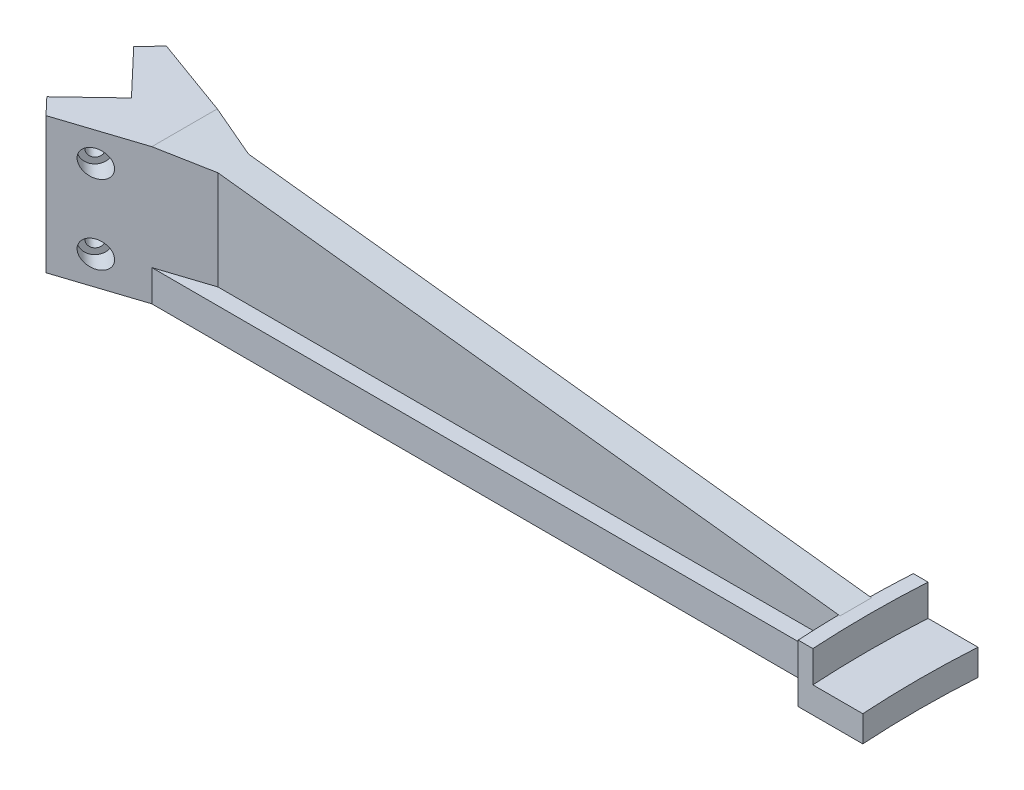
ISO-10303-21;
HEADER;
FILE_DESCRIPTION(('STEP AP214'),'2;1');
FILE_NAME('part.step','',(''),(''),'','','');
FILE_SCHEMA(('AUTOMOTIVE_DESIGN { 1 0 10303 214 1 1 1 1 }'));
ENDSEC;
DATA;
#1=APPLICATION_CONTEXT('core data for automotive mechanical design processes');
#2=APPLICATION_PROTOCOL_DEFINITION('international standard','automotive_design',2000,#1);
#3=PRODUCT_CONTEXT('',#1,'mechanical');
#4=PRODUCT('Part','Part','',(#3));
#5=PRODUCT_RELATED_PRODUCT_CATEGORY('part','',(#4));
#6=PRODUCT_DEFINITION_FORMATION('','',#4);
#7=PRODUCT_DEFINITION_CONTEXT('part definition',#1,'design');
#8=PRODUCT_DEFINITION('design','',#6,#7);
#9=PRODUCT_DEFINITION_SHAPE('','',#8);
#10=(LENGTH_UNIT() NAMED_UNIT(*) SI_UNIT(.MILLI.,.METRE.));
#11=(NAMED_UNIT(*) PLANE_ANGLE_UNIT() SI_UNIT($,.RADIAN.));
#12=(NAMED_UNIT(*) SI_UNIT($,.STERADIAN.) SOLID_ANGLE_UNIT());
#13=UNCERTAINTY_MEASURE_WITH_UNIT(LENGTH_MEASURE(1.E-05),#10,'distance_accuracy_value','');
#14=(GEOMETRIC_REPRESENTATION_CONTEXT(3) GLOBAL_UNCERTAINTY_ASSIGNED_CONTEXT((#13)) GLOBAL_UNIT_ASSIGNED_CONTEXT((#10,
#11,#12)) REPRESENTATION_CONTEXT('',''));
#15=CARTESIAN_POINT('',(0.,0.,0.));
#16=DIRECTION('',(0.,0.,1.));
#17=DIRECTION('',(1.,0.,0.));
#18=AXIS2_PLACEMENT_3D('',#15,#16,#17);
#19=CARTESIAN_POINT('',(-25.6803366585188,-12.,-9.21834934613786));
#20=DIRECTION('',(0.341057417786521,0.,-0.940042465941188));
#21=DIRECTION('',(0.940042465941188,0.,0.341057417786521));
#22=AXIS2_PLACEMENT_3D('',#19,#20,#21);
#23=PLANE('',#22);
#24=CARTESIAN_POINT('',(-271.261664320799,29.,-98.3178703823747));
#25=DIRECTION('',(-0.341057417786521,0.,0.940042465941188));
#26=DIRECTION('',(-0.940042465941188,0.,-0.341057417786521));
#27=AXIS2_PLACEMENT_3D('',#24,#25,#26);
#28=ELLIPSE('',#27,5.58833937893238,4.99999999999999);
#29=CARTESIAN_POINT('',(-276.514940651087,29.,-100.223814980668));
#30=VERTEX_POINT('',#29);
#31=EDGE_CURVE('E192',#30,#30,#28,.T.);
#32=ORIENTED_EDGE('',*,*,#31,.T.);
#33=EDGE_LOOP('',(#32));
#34=FACE_BOUND('',#33,.T.);
#35=CARTESIAN_POINT('',(-271.261664320799,-0.999999999999997,-98.3178703823747));
#36=DIRECTION('',(-0.341057417786521,0.,0.940042465941188));
#37=DIRECTION('',(-0.940042465941188,0.,-0.341057417786521));
#38=AXIS2_PLACEMENT_3D('',#35,#36,#37);
#39=ELLIPSE('',#38,5.58833937893238,4.99999999999999);
#40=CARTESIAN_POINT('',(-276.514940651087,-0.999999999999997,-100.223814980668));
#41=VERTEX_POINT('',#40);
#42=EDGE_CURVE('E327',#41,#41,#39,.T.);
#43=ORIENTED_EDGE('',*,*,#42,.T.);
#44=EDGE_LOOP('',(#43));
#45=FACE_BOUND('',#44,.T.);
#46=DIRECTION('',(0.,1.,0.));
#47=VECTOR('',#46,1.);
#48=CARTESIAN_POINT('',(-237.310427240128,-12.,-86.));
#49=LINE('',#48,#47);
#50=CARTESIAN_POINT('',(-237.310427240128,0.,-86.));
#51=VERTEX_POINT('',#50);
#52=CARTESIAN_POINT('',(-237.310427240129,37.8127309338108,-86.));
#53=VERTEX_POINT('',#52);
#54=EDGE_CURVE('E390',#51,#53,#49,.T.);
#55=ORIENTED_EDGE('',*,*,#54,.F.);
#56=DIRECTION('',(0.940042465941188,0.,0.341057417786521));
#57=VECTOR('',#56,1.);
#58=CARTESIAN_POINT('',(-25.6803366585188,0.,-9.21834934613786));
#59=LINE('',#58,#57);
#60=CARTESIAN_POINT('',(-256.02456554,0.,-92.7896886746107));
#61=VERTEX_POINT('',#60);
#62=EDGE_CURVE('E211',#61,#51,#59,.T.);
#63=ORIENTED_EDGE('',*,*,#62,.F.);
#64=DIRECTION('',(0.,1.,0.));
#65=VECTOR('',#64,1.);
#66=CARTESIAN_POINT('',(-256.02456554,-12.,-92.7896886746107));
#67=LINE('',#66,#65);
#68=CARTESIAN_POINT('',(-256.02456554,-12.,-92.7896886746107));
#69=VERTEX_POINT('',#68);
#70=EDGE_CURVE('E296',#69,#61,#67,.T.);
#71=ORIENTED_EDGE('',*,*,#70,.F.);
#72=DIRECTION('',(0.940042465941188,0.,0.341057417786521));
#73=VECTOR('',#72,1.);
#74=CARTESIAN_POINT('',(-25.6803366585188,-12.,-9.21834934613786));
#75=LINE('',#74,#73);
#76=CARTESIAN_POINT('',(-286.510767905309,-12.,-103.850407560772));
#77=VERTEX_POINT('',#76);
#78=EDGE_CURVE('E288',#77,#69,#75,.T.);
#79=ORIENTED_EDGE('',*,*,#78,.F.);
#80=DIRECTION('',(0.,1.,0.));
#81=VECTOR('',#80,1.);
#82=CARTESIAN_POINT('',(-286.510767905309,-12.,-103.850407560772));
#83=LINE('',#82,#81);
#84=CARTESIAN_POINT('',(-286.510767905309,40.,-103.850407560772));
#85=VERTEX_POINT('',#84);
#86=EDGE_CURVE('E205',#77,#85,#83,.T.);
#87=ORIENTED_EDGE('',*,*,#86,.T.);
#88=DIRECTION('',(0.940042465941188,0.,0.341057417786521));
#89=VECTOR('',#88,1.);
#90=CARTESIAN_POINT('',(-25.6803366585188,40.,-9.21834934613786));
#91=LINE('',#90,#89);
#92=CARTESIAN_POINT('',(-256.02456554,40.,-92.7896886746107));
#93=VERTEX_POINT('',#92);
#94=EDGE_CURVE('E186',#85,#93,#91,.T.);
#95=ORIENTED_EDGE('',*,*,#94,.T.);
#96=DIRECTION('',(-0.934419482049458,0.109212980858722,-0.339017339347673));
#97=VECTOR('',#96,1.);
#98=CARTESIAN_POINT('',(-23.1211234088442,12.77873625707,-8.2898395243766));
#99=LINE('',#98,#97);
#100=EDGE_CURVE('E191',#53,#93,#99,.T.);
#101=ORIENTED_EDGE('',*,*,#100,.F.);
#102=EDGE_LOOP('',(#55,#63,#71,#79,#87,#95,#101));
#103=FACE_BOUND('',#102,.T.);
#104=ADVANCED_FACE('F38',(#34,#45,#103),#23,.T.);
#105=CARTESIAN_POINT('',(-21.000464266402,-12.,-144.413552253752));
#106=DIRECTION('',(-0.309967834756297,0.,-0.950747043864188));
#107=DIRECTION('',(0.950747043864188,0.,-0.309967834756297));
#108=AXIS2_PLACEMENT_3D('',#105,#106,#107);
#109=PLANE('',#108);
#110=CARTESIAN_POINT('',(-272.154965736293,29.,-62.5307659623445));
#111=DIRECTION('',(0.309967834756297,0.,0.950747043864188));
#112=DIRECTION('',(-0.950747043864188,0.,0.309967834756297));
#113=AXIS2_PLACEMENT_3D('',#110,#111,#112);
#114=ELLIPSE('',#113,5.68470562785377,4.99999999999999);
#115=CARTESIAN_POINT('',(-277.559682807213,29.,-60.7686900676517));
#116=VERTEX_POINT('',#115);
#117=EDGE_CURVE('E337',#116,#116,#114,.F.);
#118=ORIENTED_EDGE('',*,*,#117,.T.);
#119=EDGE_LOOP('',(#118));
#120=FACE_BOUND('',#119,.T.);
#121=CARTESIAN_POINT('',(-272.154965736293,-0.999999999999997,-62.5307659623445));
#122=DIRECTION('',(0.309967834756297,0.,0.950747043864188));
#123=DIRECTION('',(-0.950747043864188,0.,0.309967834756297));
#124=AXIS2_PLACEMENT_3D('',#121,#122,#123);
#125=ELLIPSE('',#124,5.68470562785377,4.99999999999999);
#126=CARTESIAN_POINT('',(-277.559682807213,-0.999999999999997,-60.7686900676517));
#127=VERTEX_POINT('',#126);
#128=EDGE_CURVE('E342',#127,#127,#125,.F.);
#129=ORIENTED_EDGE('',*,*,#128,.T.);
#130=EDGE_LOOP('',(#129));
#131=FACE_BOUND('',#130,.T.);
#132=DIRECTION('',(-0.944930964694918,0.110441540809588,0.308071644304268));
#133=VECTOR('',#132,1.);
#134=CARTESIAN_POINT('',(-18.4404308643584,12.2316667715908,-145.24818857017));
#135=LINE('',#134,#133);
#136=CARTESIAN_POINT('',(-236.976024136559,37.7736466034316,-74.));
#137=VERTEX_POINT('',#136);
#138=CARTESIAN_POINT('',(-256.02456554,40.,-67.7896886746107));
#139=VERTEX_POINT('',#138);
#140=EDGE_CURVE('E201',#137,#139,#135,.T.);
#141=ORIENTED_EDGE('',*,*,#140,.T.);
#142=DIRECTION('',(0.950747043864188,0.,-0.309967834756297));
#143=VECTOR('',#142,1.);
#144=CARTESIAN_POINT('',(-21.000464266402,40.,-144.413552253752));
#145=LINE('',#144,#143);
#146=CARTESIAN_POINT('',(-286.510767905309,40.,-57.8504075607723));
#147=VERTEX_POINT('',#146);
#148=EDGE_CURVE('E189',#147,#139,#145,.T.);
#149=ORIENTED_EDGE('',*,*,#148,.F.);
#150=DIRECTION('',(0.,1.,0.));
#151=VECTOR('',#150,1.);
#152=CARTESIAN_POINT('',(-286.510767905309,-12.,-57.8504075607723));
#153=LINE('',#152,#151);
#154=CARTESIAN_POINT('',(-286.510767905309,-12.,-57.8504075607723));
#155=VERTEX_POINT('',#154);
#156=EDGE_CURVE('E306',#155,#147,#153,.T.);
#157=ORIENTED_EDGE('',*,*,#156,.F.);
#158=DIRECTION('',(0.950747043864188,0.,-0.309967834756297));
#159=VECTOR('',#158,1.);
#160=CARTESIAN_POINT('',(-21.000464266402,-12.,-144.413552253752));
#161=LINE('',#160,#159);
#162=CARTESIAN_POINT('',(-256.02456554,-12.,-67.7896886746107));
#163=VERTEX_POINT('',#162);
#164=EDGE_CURVE('E276',#155,#163,#161,.T.);
#165=ORIENTED_EDGE('',*,*,#164,.T.);
#166=DIRECTION('',(0.,1.,0.));
#167=VECTOR('',#166,1.);
#168=CARTESIAN_POINT('',(-256.02456554,-12.,-67.7896886746107));
#169=LINE('',#168,#167);
#170=CARTESIAN_POINT('',(-256.02456554,0.,-67.7896886746107));
#171=VERTEX_POINT('',#170);
#172=EDGE_CURVE('E309',#163,#171,#169,.T.);
#173=ORIENTED_EDGE('',*,*,#172,.T.);
#174=DIRECTION('',(0.950747043864188,0.,-0.309967834756297));
#175=VECTOR('',#174,1.);
#176=CARTESIAN_POINT('',(-21.000464266402,0.,-144.413552253752));
#177=LINE('',#176,#175);
#178=CARTESIAN_POINT('',(-236.976024136559,0.,-74.));
#179=VERTEX_POINT('',#178);
#180=EDGE_CURVE('E206',#171,#179,#177,.T.);
#181=ORIENTED_EDGE('',*,*,#180,.T.);
#182=DIRECTION('',(0.,-1.,0.));
#183=VECTOR('',#182,1.);
#184=CARTESIAN_POINT('',(-236.976024136559,-12.,-74.));
#185=LINE('',#184,#183);
#186=EDGE_CURVE('E214',#137,#179,#185,.T.);
#187=ORIENTED_EDGE('',*,*,#186,.F.);
#188=EDGE_LOOP('',(#141,#149,#157,#165,#173,#181,#187));
#189=FACE_BOUND('',#188,.T.);
#190=ADVANCED_FACE('F405',(#120,#131,#189),#109,.F.);
#191=CARTESIAN_POINT('',(0.,40.,-80.));
#192=DIRECTION('',(0.,1.,0.));
#193=DIRECTION('',(0.,0.,-1.));
#194=AXIS2_PLACEMENT_3D('',#191,#192,#193);
#195=PLANE('',#194);
#196=ORIENTED_EDGE('',*,*,#94,.F.);
#197=DIRECTION('',(0.688749461914691,0.,-0.724999433594415));
#198=VECTOR('',#197,1.);
#199=CARTESIAN_POINT('',(-162.506520414215,40.,-234.381194393503));
#200=LINE('',#199,#198);
#201=CARTESIAN_POINT('',(-292.596610314021,40.,-97.4442576568645));
#202=VERTEX_POINT('',#201);
#203=EDGE_CURVE('E224',#202,#85,#200,.T.);
#204=ORIENTED_EDGE('',*,*,#203,.F.);
#205=DIRECTION('',(-0.688749461914691,0.,-0.724999433594416));
#206=VECTOR('',#205,1.);
#207=CARTESIAN_POINT('',(-145.085185566361,40.,57.830926288042));
#208=LINE('',#207,#206);
#209=CARTESIAN_POINT('',(-276.02456554,40.,-80.));
#210=VERTEX_POINT('',#209);
#211=EDGE_CURVE('E221',#210,#202,#208,.T.);
#212=ORIENTED_EDGE('',*,*,#211,.F.);
#213=DIRECTION('',(-0.724999433594416,0.,0.688749461914691));
#214=VECTOR('',#213,1.);
#215=CARTESIAN_POINT('',(-130.939379973639,40.,-217.830926288042));
#216=LINE('',#215,#214);
#217=CARTESIAN_POINT('',(-292.596610314021,40.,-64.2565574646801));
#218=VERTEX_POINT('',#217);
#219=EDGE_CURVE('E218',#210,#218,#216,.T.);
#220=ORIENTED_EDGE('',*,*,#219,.T.);
#221=DIRECTION('',(0.688749461914691,0.,0.724999433594415));
#222=VECTOR('',#221,1.);
#223=CARTESIAN_POINT('',(-161.657230340382,40.,73.574368823362));
#224=LINE('',#223,#222);
#225=EDGE_CURVE('E208',#218,#147,#224,.T.);
#226=ORIENTED_EDGE('',*,*,#225,.T.);
#227=ORIENTED_EDGE('',*,*,#148,.T.);
#228=DIRECTION('',(0.,0.,-1.));
#229=VECTOR('',#228,1.);
#230=CARTESIAN_POINT('',(-256.02456554,40.,-57.8504075607723));
#231=LINE('',#230,#229);
#232=EDGE_CURVE('E55',#139,#93,#231,.T.);
#233=ORIENTED_EDGE('',*,*,#232,.T.);
#234=EDGE_LOOP('',(#196,#204,#212,#220,#226,#227,#233));
#235=FACE_BOUND('',#234,.T.);
#236=ADVANCED_FACE('F183',(#235),#195,.T.);
#237=CARTESIAN_POINT('',(0.,0.,-80.));
#238=DIRECTION('',(0.,1.,0.));
#239=DIRECTION('',(0.,0.,-1.));
#240=AXIS2_PLACEMENT_3D('',#237,#238,#239);
#241=PLANE('',#240);
#242=CARTESIAN_POINT('',(370.6,0.,-80.));
#243=DIRECTION('',(0.,-1.,0.));
#244=DIRECTION('',(0.,0.,-1.));
#245=AXIS2_PLACEMENT_3D('',#242,#243,#244);
#246=CIRCLE('',#245,370.6);
#247=CARTESIAN_POINT('',(0.210866790074399,0.,-92.5));
#248=VERTEX_POINT('',#247);
#249=CARTESIAN_POINT('',(0.0485730698099318,0.,-86.));
#250=VERTEX_POINT('',#249);
#251=EDGE_CURVE('E11',#248,#250,#246,.F.);
#252=ORIENTED_EDGE('',*,*,#251,.F.);
#253=DIRECTION('',(0.999999360921432,0.,0.00113055593772735));
#254=VECTOR('',#253,1.);
#255=CARTESIAN_POINT('',(0.0141322097109725,0.,-92.5002224195901));
#256=LINE('',#255,#254);
#257=EDGE_CURVE('E259',#61,#248,#256,.T.);
#258=ORIENTED_EDGE('',*,*,#257,.F.);
#259=ORIENTED_EDGE('',*,*,#62,.T.);
#260=DIRECTION('',(1.,0.,0.));
#261=VECTOR('',#260,1.);
#262=CARTESIAN_POINT('',(-256.02456554,0.,-86.));
#263=LINE('',#262,#261);
#264=EDGE_CURVE('E377',#51,#250,#263,.T.);
#265=ORIENTED_EDGE('',*,*,#264,.T.);
#266=EDGE_LOOP('',(#252,#258,#259,#265));
#267=FACE_BOUND('',#266,.T.);
#268=ADVANCED_FACE('F467',(#267),#241,.T.);
#269=CARTESIAN_POINT('',(370.6,-12.,-80.));
#270=DIRECTION('',(0.,1.,0.));
#271=DIRECTION('',(0.,0.,-1.));
#272=AXIS2_PLACEMENT_3D('',#269,#270,#271);
#273=CYLINDRICAL_SURFACE('',#272,370.6);
#274=CARTESIAN_POINT('',(370.6,10.,-80.));
#275=DIRECTION('',(0.,-1.,0.));
#276=DIRECTION('',(0.,0.,-1.));
#277=AXIS2_PLACEMENT_3D('',#274,#275,#276);
#278=CIRCLE('',#277,370.6);
#279=CARTESIAN_POINT('',(0.0485730698099318,10.,-86.));
#280=VERTEX_POINT('',#279);
#281=CARTESIAN_POINT('',(0.653571445810575,10.,-102.));
#282=VERTEX_POINT('',#281);
#283=EDGE_CURVE('E236',#280,#282,#278,.T.);
#284=ORIENTED_EDGE('',*,*,#283,.T.);
#285=DIRECTION('',(0.,1.,0.));
#286=VECTOR('',#285,1.);
#287=CARTESIAN_POINT('',(0.653571445810575,-12.,-102.));
#288=LINE('',#287,#286);
#289=CARTESIAN_POINT('',(0.653571445810575,-12.,-102.));
#290=VERTEX_POINT('',#289);
#291=EDGE_CURVE('E323',#290,#282,#288,.T.);
#292=ORIENTED_EDGE('',*,*,#291,.F.);
#293=CARTESIAN_POINT('',(370.6,-12.,-80.));
#294=DIRECTION('',(0.,-1.,0.));
#295=DIRECTION('',(0.,0.,-1.));
#296=AXIS2_PLACEMENT_3D('',#293,#294,#295);
#297=CIRCLE('',#296,370.6);
#298=CARTESIAN_POINT('',(0.210866790074399,-12.,-92.5));
#299=VERTEX_POINT('',#298);
#300=EDGE_CURVE('E262',#299,#290,#297,.T.);
#301=ORIENTED_EDGE('',*,*,#300,.F.);
#302=DIRECTION('',(0.,1.,0.));
#303=VECTOR('',#302,1.);
#304=CARTESIAN_POINT('',(0.210866790074399,-12.,-92.5));
#305=LINE('',#304,#303);
#306=EDGE_CURVE('E291',#299,#248,#305,.T.);
#307=ORIENTED_EDGE('',*,*,#306,.T.);
#308=ORIENTED_EDGE('',*,*,#251,.T.);
#309=DIRECTION('',(0.,1.,0.));
#310=VECTOR('',#309,1.);
#311=CARTESIAN_POINT('',(0.0485730698099318,-12.,-86.));
#312=LINE('',#311,#310);
#313=EDGE_CURVE('E388',#280,#250,#312,.F.);
#314=ORIENTED_EDGE('',*,*,#313,.F.);
#315=EDGE_LOOP('',(#284,#292,#301,#307,#308,#314));
#316=FACE_BOUND('',#315,.T.);
#317=ADVANCED_FACE('F452',(#316),#273,.T.);
#318=DIRECTION('',(1.,0.,0.));
#319=VECTOR('',#318,1.);
#320=CARTESIAN_POINT('',(-256.02456554,0.,-74.));
#321=LINE('',#320,#319);
#322=CARTESIAN_POINT('',(0.0485730698099318,0.,-74.));
#323=VERTEX_POINT('',#322);
#324=EDGE_CURVE('E382',#179,#323,#321,.T.);
#325=ORIENTED_EDGE('',*,*,#324,.F.);
#326=ORIENTED_EDGE('',*,*,#180,.F.);
#327=DIRECTION('',(0.999999360921432,0.,0.00113055593772736));
#328=VECTOR('',#327,1.);
#329=CARTESIAN_POINT('',(-0.0141316706693596,0.,-67.5002543735083));
#330=LINE('',#329,#328);
#331=CARTESIAN_POINT('',(0.210866790074427,0.,-67.5));
#332=VERTEX_POINT('',#331);
#333=EDGE_CURVE('E263',#171,#332,#330,.T.);
#334=ORIENTED_EDGE('',*,*,#333,.T.);
#335=EDGE_CURVE('E47',#323,#332,#246,.F.);
#336=ORIENTED_EDGE('',*,*,#335,.F.);
#337=EDGE_LOOP('',(#325,#326,#334,#336));
#338=FACE_BOUND('',#337,.T.);
#339=ADVANCED_FACE('F408',(#338),#241,.T.);
#340=CARTESIAN_POINT('',(0.0141322097109725,-12.,-92.5002224195901));
#341=DIRECTION('',(0.00113055593772735,0.,-0.999999360921431));
#342=DIRECTION('',(0.999999360921432,0.,0.00113055593772735));
#343=AXIS2_PLACEMENT_3D('',#340,#341,#342);
#344=PLANE('',#343);
#345=ORIENTED_EDGE('',*,*,#257,.T.);
#346=ORIENTED_EDGE('',*,*,#306,.F.);
#347=DIRECTION('',(0.999999360921432,0.,0.00113055593772735));
#348=VECTOR('',#347,1.);
#349=CARTESIAN_POINT('',(0.0141322097109725,-12.,-92.5002224195901));
#350=LINE('',#349,#348);
#351=EDGE_CURVE('E260',#69,#299,#350,.T.);
#352=ORIENTED_EDGE('',*,*,#351,.F.);
#353=ORIENTED_EDGE('',*,*,#70,.T.);
#354=EDGE_LOOP('',(#345,#346,#352,#353));
#355=FACE_BOUND('',#354,.T.);
#356=ADVANCED_FACE('F40',(#355),#344,.T.);
#357=CARTESIAN_POINT('',(-162.506520414215,-12.,-234.381194393503));
#358=DIRECTION('',(-0.724999433594415,0.,-0.688749461914691));
#359=DIRECTION('',(0.688749461914691,0.,-0.724999433594415));
#360=AXIS2_PLACEMENT_3D('',#357,#358,#359);
#361=PLANE('',#360);
#362=ORIENTED_EDGE('',*,*,#86,.F.);
#363=DIRECTION('',(0.688749461914691,0.,-0.724999433594415));
#364=VECTOR('',#363,1.);
#365=CARTESIAN_POINT('',(-162.506520414215,-12.,-234.381194393503));
#366=LINE('',#365,#364);
#367=CARTESIAN_POINT('',(-292.596610314021,-12.,-97.4442576568645));
#368=VERTEX_POINT('',#367);
#369=EDGE_CURVE('E286',#368,#77,#366,.T.);
#370=ORIENTED_EDGE('',*,*,#369,.F.);
#371=DIRECTION('',(0.,1.,0.));
#372=VECTOR('',#371,1.);
#373=CARTESIAN_POINT('',(-292.596610314021,-12.,-97.4442576568645));
#374=LINE('',#373,#372);
#375=EDGE_CURVE('E300',#368,#202,#374,.T.);
#376=ORIENTED_EDGE('',*,*,#375,.T.);
#377=ORIENTED_EDGE('',*,*,#203,.T.);
#378=EDGE_LOOP('',(#362,#370,#376,#377));
#379=FACE_BOUND('',#378,.T.);
#380=ADVANCED_FACE('F442',(#379),#361,.T.);
#381=CARTESIAN_POINT('',(-145.085185566361,-12.,57.830926288042));
#382=DIRECTION('',(-0.724999433594416,0.,0.688749461914691));
#383=DIRECTION('',(-0.688749461914691,0.,-0.724999433594416));
#384=AXIS2_PLACEMENT_3D('',#381,#382,#383);
#385=PLANE('',#384);
#386=CARTESIAN_POINT('',(-282.912060159147,29.,-87.2499943359442));
#387=DIRECTION('',(0.724999433594416,0.,-0.688749461914691));
#388=DIRECTION('',(-0.688749461914691,0.,-0.724999433594416));
#389=AXIS2_PLACEMENT_3D('',#386,#387,#388);
#390=CIRCLE('',#389,2.75000000000005);
#391=CARTESIAN_POINT('',(-284.806121179412,29.,-89.2437427783288));
#392=VERTEX_POINT('',#391);
#393=EDGE_CURVE('E336',#392,#392,#390,.T.);
#394=ORIENTED_EDGE('',*,*,#393,.T.);
#395=EDGE_LOOP('',(#394));
#396=FACE_BOUND('',#395,.T.);
#397=CARTESIAN_POINT('',(-282.912060159147,-0.999999999999997,-87.2499943359442));
#398=DIRECTION('',(0.724999433594416,0.,-0.688749461914691));
#399=DIRECTION('',(-0.688749461914691,0.,-0.724999433594416));
#400=AXIS2_PLACEMENT_3D('',#397,#398,#399);
#401=CIRCLE('',#400,2.75000000000004);
#402=CARTESIAN_POINT('',(-284.806121179412,-0.999999999999997,-89.2437427783288));
#403=VERTEX_POINT('',#402);
#404=EDGE_CURVE('E341',#403,#403,#401,.T.);
#405=ORIENTED_EDGE('',*,*,#404,.T.);
#406=EDGE_LOOP('',(#405));
#407=FACE_BOUND('',#406,.T.);
#408=ORIENTED_EDGE('',*,*,#375,.F.);
#409=DIRECTION('',(-0.688749461914691,0.,-0.724999433594416));
#410=VECTOR('',#409,1.);
#411=CARTESIAN_POINT('',(-145.085185566361,-12.,57.830926288042));
#412=LINE('',#411,#410);
#413=CARTESIAN_POINT('',(-276.02456554,-12.,-80.));
#414=VERTEX_POINT('',#413);
#415=EDGE_CURVE('E284',#414,#368,#412,.T.);
#416=ORIENTED_EDGE('',*,*,#415,.F.);
#417=DIRECTION('',(0.,1.,0.));
#418=VECTOR('',#417,1.);
#419=CARTESIAN_POINT('',(-276.02456554,-12.,-80.));
#420=LINE('',#419,#418);
#421=EDGE_CURVE('E302',#414,#210,#420,.T.);
#422=ORIENTED_EDGE('',*,*,#421,.T.);
#423=ORIENTED_EDGE('',*,*,#211,.T.);
#424=EDGE_LOOP('',(#408,#416,#422,#423));
#425=FACE_BOUND('',#424,.T.);
#426=ADVANCED_FACE('F439',(#396,#407,#425),#385,.T.);
#427=CARTESIAN_POINT('',(-130.939379973639,-12.,-217.830926288042));
#428=DIRECTION('',(0.688749461914691,0.,0.724999433594416));
#429=DIRECTION('',(-0.724999433594416,0.,0.688749461914691));
#430=AXIS2_PLACEMENT_3D('',#427,#428,#429);
#431=PLANE('',#430);
#432=CARTESIAN_POINT('',(-283.284099342176,29.,-73.1034428879333));
#433=DIRECTION('',(-0.688749461914691,0.,-0.724999433594416));
#434=DIRECTION('',(-0.724999433594416,0.,0.688749461914691));
#435=AXIS2_PLACEMENT_3D('',#432,#433,#434);
#436=ELLIPSE('',#435,2.75361842105268,2.75000000000005);
#437=CARTESIAN_POINT('',(-285.280471137774,29.,-71.2068896821148));
#438=VERTEX_POINT('',#437);
#439=EDGE_CURVE('E349',#438,#438,#436,.F.);
#440=ORIENTED_EDGE('',*,*,#439,.T.);
#441=EDGE_LOOP('',(#440));
#442=FACE_BOUND('',#441,.T.);
#443=CARTESIAN_POINT('',(-283.284099342176,-0.999999999999997,-73.1034428879333));
#444=DIRECTION('',(-0.688749461914691,0.,-0.724999433594416));
#445=DIRECTION('',(-0.724999433594416,0.,0.688749461914691));
#446=AXIS2_PLACEMENT_3D('',#443,#444,#445);
#447=ELLIPSE('',#446,2.75361842105268,2.75000000000004);
#448=CARTESIAN_POINT('',(-285.280471137774,-0.999999999999997,-71.2068896821148));
#449=VERTEX_POINT('',#448);
#450=EDGE_CURVE('E357',#449,#449,#447,.F.);
#451=ORIENTED_EDGE('',*,*,#450,.T.);
#452=EDGE_LOOP('',(#451));
#453=FACE_BOUND('',#452,.T.);
#454=ORIENTED_EDGE('',*,*,#421,.F.);
#455=DIRECTION('',(-0.724999433594416,0.,0.688749461914691));
#456=VECTOR('',#455,1.);
#457=CARTESIAN_POINT('',(-130.939379973639,-12.,-217.830926288042));
#458=LINE('',#457,#456);
#459=CARTESIAN_POINT('',(-292.596610314021,-12.,-64.2565574646801));
#460=VERTEX_POINT('',#459);
#461=EDGE_CURVE('E281',#414,#460,#458,.T.);
#462=ORIENTED_EDGE('',*,*,#461,.T.);
#463=DIRECTION('',(0.,1.,0.));
#464=VECTOR('',#463,1.);
#465=CARTESIAN_POINT('',(-292.596610314021,-12.,-64.2565574646801));
#466=LINE('',#465,#464);
#467=EDGE_CURVE('E304',#460,#218,#466,.T.);
#468=ORIENTED_EDGE('',*,*,#467,.T.);
#469=ORIENTED_EDGE('',*,*,#219,.F.);
#470=EDGE_LOOP('',(#454,#462,#468,#469));
#471=FACE_BOUND('',#470,.T.);
#472=ADVANCED_FACE('F436',(#442,#453,#471),#431,.F.);
#473=CARTESIAN_POINT('',(-161.657230340382,-12.,73.574368823362));
#474=DIRECTION('',(0.724999433594415,0.,-0.688749461914691));
#475=DIRECTION('',(0.688749461914691,0.,0.724999433594415));
#476=AXIS2_PLACEMENT_3D('',#473,#474,#475);
#477=PLANE('',#476);
#478=ORIENTED_EDGE('',*,*,#467,.F.);
#479=DIRECTION('',(0.688749461914691,0.,0.724999433594415));
#480=VECTOR('',#479,1.);
#481=CARTESIAN_POINT('',(-161.657230340382,-12.,73.574368823362));
#482=LINE('',#481,#480);
#483=EDGE_CURVE('E279',#460,#155,#482,.T.);
#484=ORIENTED_EDGE('',*,*,#483,.T.);
#485=ORIENTED_EDGE('',*,*,#156,.T.);
#486=ORIENTED_EDGE('',*,*,#225,.F.);
#487=EDGE_LOOP('',(#478,#484,#485,#486));
#488=FACE_BOUND('',#487,.T.);
#489=ADVANCED_FACE('F430',(#488),#477,.F.);
#490=CARTESIAN_POINT('',(-0.0141316706693596,-12.,-67.5002543735083));
#491=DIRECTION('',(0.00113055593772736,0.,-0.999999360921431));
#492=DIRECTION('',(0.999999360921432,0.,0.00113055593772736));
#493=AXIS2_PLACEMENT_3D('',#490,#491,#492);
#494=PLANE('',#493);
#495=ORIENTED_EDGE('',*,*,#333,.F.);
#496=ORIENTED_EDGE('',*,*,#172,.F.);
#497=DIRECTION('',(0.999999360921432,0.,0.00113055593772736));
#498=VECTOR('',#497,1.);
#499=CARTESIAN_POINT('',(-0.0141316706693596,-12.,-67.5002543735083));
#500=LINE('',#499,#498);
#501=CARTESIAN_POINT('',(0.210866790074399,-12.,-67.5));
#502=VERTEX_POINT('',#501);
#503=EDGE_CURVE('E273',#163,#502,#500,.T.);
#504=ORIENTED_EDGE('',*,*,#503,.T.);
#505=DIRECTION('',(0.,1.,0.));
#506=VECTOR('',#505,1.);
#507=CARTESIAN_POINT('',(0.210866790074399,-12.,-67.5));
#508=LINE('',#507,#506);
#509=EDGE_CURVE('E312',#502,#332,#508,.T.);
#510=ORIENTED_EDGE('',*,*,#509,.T.);
#511=EDGE_LOOP('',(#495,#496,#504,#510));
#512=FACE_BOUND('',#511,.T.);
#513=ADVANCED_FACE('F413',(#512),#494,.F.);
#514=DIRECTION('',(0.,1.,0.));
#515=VECTOR('',#514,1.);
#516=CARTESIAN_POINT('',(0.0485730698099318,-12.,-74.));
#517=LINE('',#516,#515);
#518=CARTESIAN_POINT('',(0.0485730698099318,10.,-74.));
#519=VERTEX_POINT('',#518);
#520=EDGE_CURVE('E393',#519,#323,#517,.F.);
#521=ORIENTED_EDGE('',*,*,#520,.T.);
#522=ORIENTED_EDGE('',*,*,#335,.T.);
#523=ORIENTED_EDGE('',*,*,#509,.F.);
#524=CARTESIAN_POINT('',(0.653571445810575,-12.,-58.));
#525=VERTEX_POINT('',#524);
#526=EDGE_CURVE('E267',#525,#502,#297,.T.);
#527=ORIENTED_EDGE('',*,*,#526,.F.);
#528=DIRECTION('',(0.,1.,0.));
#529=VECTOR('',#528,1.);
#530=CARTESIAN_POINT('',(0.653571445810575,-12.,-58.));
#531=LINE('',#530,#529);
#532=CARTESIAN_POINT('',(0.653571445810575,10.,-58.));
#533=VERTEX_POINT('',#532);
#534=EDGE_CURVE('E314',#525,#533,#531,.T.);
#535=ORIENTED_EDGE('',*,*,#534,.T.);
#536=EDGE_CURVE('E237',#533,#519,#278,.T.);
#537=ORIENTED_EDGE('',*,*,#536,.T.);
#538=EDGE_LOOP('',(#521,#522,#523,#527,#535,#537));
#539=FACE_BOUND('',#538,.T.);
#540=ADVANCED_FACE('F410',(#539),#273,.T.);
#541=CARTESIAN_POINT('',(0.,-12.,-58.));
#542=DIRECTION('',(0.,0.,-1.));
#543=DIRECTION('',(1.,0.,0.));
#544=AXIS2_PLACEMENT_3D('',#541,#542,#543);
#545=PLANE('',#544);
#546=DIRECTION('',(0.,-1.,0.));
#547=VECTOR('',#546,1.);
#548=CARTESIAN_POINT('',(25.3402114349254,-2.,-58.));
#549=LINE('',#548,#547);
#550=CARTESIAN_POINT('',(25.3402114349254,-2.,-58.));
#551=VERTEX_POINT('',#550);
#552=CARTESIAN_POINT('',(25.3402114349254,-12.,-58.));
#553=VERTEX_POINT('',#552);
#554=EDGE_CURVE('E252',#551,#553,#549,.T.);
#555=ORIENTED_EDGE('',*,*,#554,.F.);
#556=DIRECTION('',(1.,0.,0.));
#557=VECTOR('',#556,1.);
#558=CARTESIAN_POINT('',(0.,-2.,-58.));
#559=LINE('',#558,#557);
#560=CARTESIAN_POINT('',(6.26361696915306,-2.,-58.));
#561=VERTEX_POINT('',#560);
#562=EDGE_CURVE('E246',#561,#551,#559,.T.);
#563=ORIENTED_EDGE('',*,*,#562,.F.);
#564=DIRECTION('',(0.,1.,0.));
#565=VECTOR('',#564,1.);
#566=CARTESIAN_POINT('',(6.26361696915312,-12.,-58.));
#567=LINE('',#566,#565);
#568=CARTESIAN_POINT('',(6.26361696915306,10.,-58.));
#569=VERTEX_POINT('',#568);
#570=EDGE_CURVE('E317',#561,#569,#567,.T.);
#571=ORIENTED_EDGE('',*,*,#570,.T.);
#572=DIRECTION('',(1.,0.,0.));
#573=VECTOR('',#572,1.);
#574=CARTESIAN_POINT('',(0.,10.,-58.));
#575=LINE('',#574,#573);
#576=EDGE_CURVE('E233',#533,#569,#575,.T.);
#577=ORIENTED_EDGE('',*,*,#576,.F.);
#578=ORIENTED_EDGE('',*,*,#534,.F.);
#579=DIRECTION('',(1.,0.,0.));
#580=VECTOR('',#579,1.);
#581=CARTESIAN_POINT('',(0.,-12.,-58.));
#582=LINE('',#581,#580);
#583=EDGE_CURVE('E270',#525,#553,#582,.T.);
#584=ORIENTED_EDGE('',*,*,#583,.T.);
#585=EDGE_LOOP('',(#555,#563,#571,#577,#578,#584));
#586=FACE_BOUND('',#585,.T.);
#587=ADVANCED_FACE('F421',(#586),#545,.F.);
#588=CARTESIAN_POINT('',(370.6,-12.,-80.));
#589=DIRECTION('',(0.,1.,0.));
#590=DIRECTION('',(0.,0.,-1.));
#591=AXIS2_PLACEMENT_3D('',#588,#589,#590);
#592=CYLINDRICAL_SURFACE('',#591,365.);
#593=DIRECTION('',(0.,1.,0.));
#594=VECTOR('',#593,1.);
#595=CARTESIAN_POINT('',(6.26361696915312,-12.,-102.));
#596=LINE('',#595,#594);
#597=CARTESIAN_POINT('',(6.26361696915306,-2.,-102.));
#598=VERTEX_POINT('',#597);
#599=CARTESIAN_POINT('',(6.26361696915306,10.,-102.));
#600=VERTEX_POINT('',#599);
#601=EDGE_CURVE('E320',#598,#600,#596,.T.);
#602=ORIENTED_EDGE('',*,*,#601,.T.);
#603=CARTESIAN_POINT('',(370.6,10.,-80.));
#604=DIRECTION('',(0.,-1.,0.));
#605=DIRECTION('',(0.,0.,-1.));
#606=AXIS2_PLACEMENT_3D('',#603,#604,#605);
#607=CIRCLE('',#606,365.);
#608=EDGE_CURVE('E230',#569,#600,#607,.T.);
#609=ORIENTED_EDGE('',*,*,#608,.F.);
#610=ORIENTED_EDGE('',*,*,#570,.F.);
#611=CARTESIAN_POINT('',(370.6,-2.,-80.));
#612=DIRECTION('',(0.,-1.,0.));
#613=DIRECTION('',(0.,0.,-1.));
#614=AXIS2_PLACEMENT_3D('',#611,#612,#613);
#615=CIRCLE('',#614,365.);
#616=EDGE_CURVE('E249',#561,#598,#615,.T.);
#617=ORIENTED_EDGE('',*,*,#616,.T.);
#618=EDGE_LOOP('',(#602,#609,#610,#617));
#619=FACE_BOUND('',#618,.T.);
#620=ADVANCED_FACE('F464',(#619),#592,.F.);
#621=CARTESIAN_POINT('',(0.,-12.,-102.));
#622=DIRECTION('',(0.,0.,-1.));
#623=DIRECTION('',(1.,0.,0.));
#624=AXIS2_PLACEMENT_3D('',#621,#622,#623);
#625=PLANE('',#624);
#626=DIRECTION('',(1.,0.,0.));
#627=VECTOR('',#626,1.);
#628=CARTESIAN_POINT('',(0.,-2.,-102.));
#629=LINE('',#628,#627);
#630=CARTESIAN_POINT('',(25.3402114349254,-2.,-102.));
#631=VERTEX_POINT('',#630);
#632=EDGE_CURVE('E241',#598,#631,#629,.T.);
#633=ORIENTED_EDGE('',*,*,#632,.T.);
#634=DIRECTION('',(0.,-1.,0.));
#635=VECTOR('',#634,1.);
#636=CARTESIAN_POINT('',(25.3402114349254,-2.,-102.));
#637=LINE('',#636,#635);
#638=CARTESIAN_POINT('',(25.3402114349254,-12.,-102.));
#639=VERTEX_POINT('',#638);
#640=EDGE_CURVE('E256',#631,#639,#637,.T.);
#641=ORIENTED_EDGE('',*,*,#640,.T.);
#642=DIRECTION('',(1.,0.,0.));
#643=VECTOR('',#642,1.);
#644=CARTESIAN_POINT('',(0.,-12.,-102.));
#645=LINE('',#644,#643);
#646=EDGE_CURVE('E266',#290,#639,#645,.T.);
#647=ORIENTED_EDGE('',*,*,#646,.F.);
#648=ORIENTED_EDGE('',*,*,#291,.T.);
#649=DIRECTION('',(1.,0.,0.));
#650=VECTOR('',#649,1.);
#651=CARTESIAN_POINT('',(0.,10.,-102.));
#652=LINE('',#651,#650);
#653=EDGE_CURVE('E226',#282,#600,#652,.T.);
#654=ORIENTED_EDGE('',*,*,#653,.T.);
#655=ORIENTED_EDGE('',*,*,#601,.F.);
#656=EDGE_LOOP('',(#633,#641,#647,#648,#654,#655));
#657=FACE_BOUND('',#656,.T.);
#658=ADVANCED_FACE('F455',(#657),#625,.T.);
#659=CARTESIAN_POINT('',(0.,-12.,-80.));
#660=DIRECTION('',(0.,1.,0.));
#661=DIRECTION('',(0.,0.,-1.));
#662=AXIS2_PLACEMENT_3D('',#659,#660,#661);
#663=PLANE('',#662);
#664=CARTESIAN_POINT('',(370.6,-12.,-80.));
#665=DIRECTION('',(0.,-1.,0.));
#666=DIRECTION('',(0.,0.,-1.));
#667=AXIS2_PLACEMENT_3D('',#664,#665,#666);
#668=CIRCLE('',#667,345.96);
#669=EDGE_CURVE('E240',#553,#639,#668,.T.);
#670=ORIENTED_EDGE('',*,*,#669,.F.);
#671=ORIENTED_EDGE('',*,*,#583,.F.);
#672=ORIENTED_EDGE('',*,*,#526,.T.);
#673=ORIENTED_EDGE('',*,*,#503,.F.);
#674=ORIENTED_EDGE('',*,*,#164,.F.);
#675=ORIENTED_EDGE('',*,*,#483,.F.);
#676=ORIENTED_EDGE('',*,*,#461,.F.);
#677=ORIENTED_EDGE('',*,*,#415,.T.);
#678=ORIENTED_EDGE('',*,*,#369,.T.);
#679=ORIENTED_EDGE('',*,*,#78,.T.);
#680=ORIENTED_EDGE('',*,*,#351,.T.);
#681=ORIENTED_EDGE('',*,*,#300,.T.);
#682=ORIENTED_EDGE('',*,*,#646,.T.);
#683=EDGE_LOOP('',(#670,#671,#672,#673,#674,#675,#676,#677,#678,#679,#680,#681,#682));
#684=FACE_BOUND('',#683,.T.);
#685=ADVANCED_FACE('F416',(#684),#663,.F.);
#686=CARTESIAN_POINT('',(370.6,-2.,-80.));
#687=DIRECTION('',(0.,-1.,0.));
#688=DIRECTION('',(0.,0.,1.));
#689=AXIS2_PLACEMENT_3D('',#686,#687,#688);
#690=CYLINDRICAL_SURFACE('',#689,345.96);
#691=ORIENTED_EDGE('',*,*,#669,.T.);
#692=ORIENTED_EDGE('',*,*,#640,.F.);
#693=CARTESIAN_POINT('',(370.6,-2.,-80.));
#694=DIRECTION('',(0.,-1.,0.));
#695=DIRECTION('',(0.,0.,-1.));
#696=AXIS2_PLACEMENT_3D('',#693,#694,#695);
#697=CIRCLE('',#696,345.96);
#698=EDGE_CURVE('E244',#551,#631,#697,.T.);
#699=ORIENTED_EDGE('',*,*,#698,.F.);
#700=ORIENTED_EDGE('',*,*,#554,.T.);
#701=EDGE_LOOP('',(#691,#692,#699,#700));
#702=FACE_BOUND('',#701,.T.);
#703=ADVANCED_FACE('F458',(#702),#690,.F.);
#704=CARTESIAN_POINT('',(370.6,-2.,-80.));
#705=DIRECTION('',(0.,1.,0.));
#706=DIRECTION('',(0.,0.,-1.));
#707=AXIS2_PLACEMENT_3D('',#704,#705,#706);
#708=PLANE('',#707);
#709=ORIENTED_EDGE('',*,*,#632,.F.);
#710=ORIENTED_EDGE('',*,*,#616,.F.);
#711=ORIENTED_EDGE('',*,*,#562,.T.);
#712=ORIENTED_EDGE('',*,*,#698,.T.);
#713=EDGE_LOOP('',(#709,#710,#711,#712));
#714=FACE_BOUND('',#713,.T.);
#715=ADVANCED_FACE('F462',(#714),#708,.T.);
#716=CARTESIAN_POINT('',(370.6,10.,-80.));
#717=DIRECTION('',(0.,1.,0.));
#718=DIRECTION('',(0.,0.,-1.));
#719=AXIS2_PLACEMENT_3D('',#716,#717,#718);
#720=PLANE('',#719);
#721=DIRECTION('',(0.,0.,-1.));
#722=VECTOR('',#721,1.);
#723=CARTESIAN_POINT('',(0.653571445810575,10.,-74.));
#724=LINE('',#723,#722);
#725=CARTESIAN_POINT('',(0.653571445810575,10.,-74.));
#726=VERTEX_POINT('',#725);
#727=CARTESIAN_POINT('',(0.653571445810575,10.,-86.));
#728=VERTEX_POINT('',#727);
#729=EDGE_CURVE('E385',#726,#728,#724,.T.);
#730=ORIENTED_EDGE('',*,*,#729,.F.);
#731=DIRECTION('',(-1.,0.,0.));
#732=VECTOR('',#731,1.);
#733=CARTESIAN_POINT('',(370.6,10.,-74.));
#734=LINE('',#733,#732);
#735=EDGE_CURVE('E392',#726,#519,#734,.T.);
#736=ORIENTED_EDGE('',*,*,#735,.T.);
#737=ORIENTED_EDGE('',*,*,#536,.F.);
#738=ORIENTED_EDGE('',*,*,#576,.T.);
#739=ORIENTED_EDGE('',*,*,#608,.T.);
#740=ORIENTED_EDGE('',*,*,#653,.F.);
#741=ORIENTED_EDGE('',*,*,#283,.F.);
#742=DIRECTION('',(-1.,0.,0.));
#743=VECTOR('',#742,1.);
#744=CARTESIAN_POINT('',(370.6,10.,-86.));
#745=LINE('',#744,#743);
#746=EDGE_CURVE('E63',#728,#280,#745,.T.);
#747=ORIENTED_EDGE('',*,*,#746,.F.);
#748=EDGE_LOOP('',(#730,#736,#737,#738,#739,#740,#741,#747));
#749=FACE_BOUND('',#748,.T.);
#750=ADVANCED_FACE('F425',(#749),#720,.T.);
#751=CARTESIAN_POINT('',(0.,0.,-74.));
#752=DIRECTION('',(0.,0.,1.));
#753=DIRECTION('',(-1.,0.,0.));
#754=AXIS2_PLACEMENT_3D('',#751,#752,#753);
#755=PLANE('',#754);
#756=ORIENTED_EDGE('',*,*,#186,.T.);
#757=ORIENTED_EDGE('',*,*,#324,.T.);
#758=ORIENTED_EDGE('',*,*,#520,.F.);
#759=ORIENTED_EDGE('',*,*,#735,.F.);
#760=DIRECTION('',(-0.993238969664045,0.116087678677396,0.));
#761=VECTOR('',#760,1.);
#762=CARTESIAN_POINT('',(0.653571445810575,10.,-74.));
#763=LINE('',#762,#761);
#764=EDGE_CURVE('E380',#726,#137,#763,.T.);
#765=ORIENTED_EDGE('',*,*,#764,.T.);
#766=EDGE_LOOP('',(#756,#757,#758,#759,#765));
#767=FACE_BOUND('',#766,.T.);
#768=ADVANCED_FACE('F401',(#767),#755,.T.);
#769=CARTESIAN_POINT('',(0.653571445810575,10.,-74.));
#770=DIRECTION('',(0.116087678677396,0.993238969664045,0.));
#771=DIRECTION('',(-0.993238969664045,0.116087678677396,0.));
#772=AXIS2_PLACEMENT_3D('',#769,#770,#771);
#773=PLANE('',#772);
#774=ORIENTED_EDGE('',*,*,#100,.T.);
#775=ORIENTED_EDGE('',*,*,#232,.F.);
#776=ORIENTED_EDGE('',*,*,#140,.F.);
#777=ORIENTED_EDGE('',*,*,#764,.F.);
#778=ORIENTED_EDGE('',*,*,#729,.T.);
#779=DIRECTION('',(-0.993238969664045,0.116087678677396,0.));
#780=VECTOR('',#779,1.);
#781=CARTESIAN_POINT('',(0.653571445810575,10.,-86.));
#782=LINE('',#781,#780);
#783=EDGE_CURVE('E197',#728,#53,#782,.T.);
#784=ORIENTED_EDGE('',*,*,#783,.T.);
#785=EDGE_LOOP('',(#774,#775,#776,#777,#778,#784));
#786=FACE_BOUND('',#785,.T.);
#787=ADVANCED_FACE('F195',(#786),#773,.T.);
#788=CARTESIAN_POINT('',(0.,0.,-86.));
#789=DIRECTION('',(0.,0.,1.));
#790=DIRECTION('',(-1.,0.,0.));
#791=AXIS2_PLACEMENT_3D('',#788,#789,#790);
#792=PLANE('',#791);
#793=ORIENTED_EDGE('',*,*,#54,.T.);
#794=ORIENTED_EDGE('',*,*,#783,.F.);
#795=ORIENTED_EDGE('',*,*,#746,.T.);
#796=ORIENTED_EDGE('',*,*,#313,.T.);
#797=ORIENTED_EDGE('',*,*,#264,.F.);
#798=EDGE_LOOP('',(#793,#794,#795,#796,#797));
#799=FACE_BOUND('',#798,.T.);
#800=ADVANCED_FACE('F465',(#799),#792,.F.);
#801=CARTESIAN_POINT('',(-112.597913427131,-0.999999999999997,-249.048433731359));
#802=DIRECTION('',(-0.724999433594416,0.,0.688749461914691));
#803=DIRECTION('',(-0.688749461914691,0.,-0.724999433594416));
#804=AXIS2_PLACEMENT_3D('',#801,#802,#803);
#805=CYLINDRICAL_SURFACE('',#804,4.99999999999999);
#806=ORIENTED_EDGE('',*,*,#42,.F.);
#807=EDGE_LOOP('',(#806));
#808=FACE_BOUND('',#807,.T.);
#809=CARTESIAN_POINT('',(-277.112064690391,-0.999999999999997,-92.7599900312617));
#810=DIRECTION('',(0.724999433594416,0.,-0.688749461914691));
#811=DIRECTION('',(-0.688749461914691,0.,-0.724999433594416));
#812=AXIS2_PLACEMENT_3D('',#809,#810,#811);
#813=CIRCLE('',#812,4.99999999999999);
#814=CARTESIAN_POINT('',(-280.555811999965,-0.999999999999997,-96.3849871992338));
#815=VERTEX_POINT('',#814);
#816=EDGE_CURVE('E370',#815,#815,#813,.T.);
#817=ORIENTED_EDGE('',*,*,#816,.F.);
#818=EDGE_LOOP('',(#817));
#819=FACE_BOUND('',#818,.T.);
#820=ADVANCED_FACE('F522',(#808,#819),#805,.F.);
#821=CARTESIAN_POINT('',(-277.112064690391,-0.999999999999997,-92.7599900312617));
#822=DIRECTION('',(-0.724999433594416,0.,0.688749461914691));
#823=DIRECTION('',(-0.688749461914691,0.,-0.724999433594416));
#824=AXIS2_PLACEMENT_3D('',#821,#822,#823);
#825=PLANE('',#824);
#826=CARTESIAN_POINT('',(-277.112064690391,-0.999999999999997,-92.7599900312617));
#827=DIRECTION('',(0.724999433594416,0.,-0.688749461914691));
#828=DIRECTION('',(-0.688749461914691,0.,-0.724999433594416));
#829=AXIS2_PLACEMENT_3D('',#826,#827,#828);
#830=CIRCLE('',#829,2.75000000000004);
#831=CARTESIAN_POINT('',(-279.006125710657,-0.999999999999997,-94.7537384736464));
#832=VERTEX_POINT('',#831);
#833=EDGE_CURVE('E338',#832,#832,#830,.T.);
#834=ORIENTED_EDGE('',*,*,#833,.F.);
#835=EDGE_LOOP('',(#834));
#836=FACE_BOUND('',#835,.T.);
#837=ORIENTED_EDGE('',*,*,#816,.T.);
#838=EDGE_LOOP('',(#837));
#839=FACE_BOUND('',#838,.T.);
#840=ADVANCED_FACE('F523',(#836,#839),#825,.F.);
#841=CARTESIAN_POINT('',(-112.597913427131,29.,-249.048433731359));
#842=DIRECTION('',(-0.724999433594416,0.,0.688749461914691));
#843=DIRECTION('',(-0.688749461914691,0.,-0.724999433594416));
#844=AXIS2_PLACEMENT_3D('',#841,#842,#843);
#845=CYLINDRICAL_SURFACE('',#844,4.99999999999999);
#846=ORIENTED_EDGE('',*,*,#31,.F.);
#847=EDGE_LOOP('',(#846));
#848=FACE_BOUND('',#847,.T.);
#849=CARTESIAN_POINT('',(-277.112064690391,29.,-92.7599900312617));
#850=DIRECTION('',(0.724999433594416,0.,-0.688749461914691));
#851=DIRECTION('',(-0.688749461914691,0.,-0.724999433594416));
#852=AXIS2_PLACEMENT_3D('',#849,#850,#851);
#853=CIRCLE('',#852,4.99999999999999);
#854=CARTESIAN_POINT('',(-280.555811999965,29.,-96.3849871992338));
#855=VERTEX_POINT('',#854);
#856=EDGE_CURVE('E330',#855,#855,#853,.T.);
#857=ORIENTED_EDGE('',*,*,#856,.F.);
#858=EDGE_LOOP('',(#857));
#859=FACE_BOUND('',#858,.T.);
#860=ADVANCED_FACE('F526',(#848,#859),#845,.F.);
#861=CARTESIAN_POINT('',(-277.112064690391,29.,-92.7599900312617));
#862=DIRECTION('',(-0.724999433594416,0.,0.688749461914691));
#863=DIRECTION('',(-0.688749461914691,0.,-0.724999433594416));
#864=AXIS2_PLACEMENT_3D('',#861,#862,#863);
#865=PLANE('',#864);
#866=CARTESIAN_POINT('',(-277.112064690391,29.,-92.7599900312617));
#867=DIRECTION('',(0.724999433594416,0.,-0.688749461914691));
#868=DIRECTION('',(-0.688749461914691,0.,-0.724999433594416));
#869=AXIS2_PLACEMENT_3D('',#866,#867,#868);
#870=CIRCLE('',#869,2.75000000000005);
#871=CARTESIAN_POINT('',(-279.006125710657,29.,-94.7537384736464));
#872=VERTEX_POINT('',#871);
#873=EDGE_CURVE('E333',#872,#872,#870,.T.);
#874=ORIENTED_EDGE('',*,*,#873,.F.);
#875=EDGE_LOOP('',(#874));
#876=FACE_BOUND('',#875,.T.);
#877=ORIENTED_EDGE('',*,*,#856,.T.);
#878=EDGE_LOOP('',(#877));
#879=FACE_BOUND('',#878,.T.);
#880=ADVANCED_FACE('F533',(#876,#879),#865,.F.);
#881=CARTESIAN_POINT('',(-112.597913427131,29.,-249.048433731359));
#882=DIRECTION('',(-0.724999433594416,0.,0.688749461914691));
#883=DIRECTION('',(-0.688749461914691,0.,-0.724999433594416));
#884=AXIS2_PLACEMENT_3D('',#881,#882,#883);
#885=CYLINDRICAL_SURFACE('',#884,2.75000000000005);
#886=ORIENTED_EDGE('',*,*,#393,.F.);
#887=EDGE_LOOP('',(#886));
#888=FACE_BOUND('',#887,.T.);
#889=ORIENTED_EDGE('',*,*,#873,.T.);
#890=EDGE_LOOP('',(#889));
#891=FACE_BOUND('',#890,.T.);
#892=ADVANCED_FACE('F537',(#888,#891),#885,.F.);
#893=CARTESIAN_POINT('',(-112.597913427131,-0.999999999999997,-249.048433731359));
#894=DIRECTION('',(-0.724999433594416,0.,0.688749461914691));
#895=DIRECTION('',(-0.688749461914691,0.,-0.724999433594416));
#896=AXIS2_PLACEMENT_3D('',#893,#894,#895);
#897=CYLINDRICAL_SURFACE('',#896,2.75000000000004);
#898=ORIENTED_EDGE('',*,*,#404,.F.);
#899=EDGE_LOOP('',(#898));
#900=FACE_BOUND('',#899,.T.);
#901=ORIENTED_EDGE('',*,*,#833,.T.);
#902=EDGE_LOOP('',(#901));
#903=FACE_BOUND('',#902,.T.);
#904=ADVANCED_FACE('F539',(#900,#903),#897,.F.);
#905=CARTESIAN_POINT('',(-113.447203500964,-0.999999999999997,88.2416081612171));
#906=DIRECTION('',(-0.724999433594416,0.,-0.688749461914691));
#907=DIRECTION('',(0.688749461914691,0.,-0.724999433594416));
#908=AXIS2_PLACEMENT_3D('',#905,#906,#907);
#909=CYLINDRICAL_SURFACE('',#908,4.99999999999999);
#910=CARTESIAN_POINT('',(-277.112064690391,-0.999999999999997,-67.2400099687383));
#911=DIRECTION('',(-0.724999433594416,0.,-0.688749461914691));
#912=DIRECTION('',(-0.688749461914691,0.,0.724999433594416));
#913=AXIS2_PLACEMENT_3D('',#910,#911,#912);
#914=CIRCLE('',#913,4.99999999999999);
#915=CARTESIAN_POINT('',(-280.555811999965,-0.999999999999997,-63.6150128007662));
#916=VERTEX_POINT('',#915);
#917=EDGE_CURVE('E361',#916,#916,#914,.T.);
#918=ORIENTED_EDGE('',*,*,#917,.T.);
#919=EDGE_LOOP('',(#918));
#920=FACE_BOUND('',#919,.T.);
#921=ORIENTED_EDGE('',*,*,#128,.F.);
#922=EDGE_LOOP('',(#921));
#923=FACE_BOUND('',#922,.T.);
#924=ADVANCED_FACE('F542',(#920,#923),#909,.F.);
#925=CARTESIAN_POINT('',(-277.112064690391,-0.999999999999997,-67.2400099687383));
#926=DIRECTION('',(-0.724999433594416,0.,-0.688749461914691));
#927=DIRECTION('',(-0.688749461914691,0.,0.724999433594416));
#928=AXIS2_PLACEMENT_3D('',#925,#926,#927);
#929=PLANE('',#928);
#930=CARTESIAN_POINT('',(-277.112064690391,-0.999999999999997,-67.2400099687383));
#931=DIRECTION('',(0.724999433594416,0.,0.688749461914691));
#932=DIRECTION('',(0.688749461914691,0.,-0.724999433594416));
#933=AXIS2_PLACEMENT_3D('',#930,#931,#932);
#934=CIRCLE('',#933,2.75000000000004);
#935=CARTESIAN_POINT('',(-275.218003670126,-0.999999999999997,-69.233758411123));
#936=VERTEX_POINT('',#935);
#937=EDGE_CURVE('E42',#936,#936,#934,.F.);
#938=ORIENTED_EDGE('',*,*,#937,.T.);
#939=EDGE_LOOP('',(#938));
#940=FACE_BOUND('',#939,.T.);
#941=ORIENTED_EDGE('',*,*,#917,.F.);
#942=EDGE_LOOP('',(#941));
#943=FACE_BOUND('',#942,.T.);
#944=ADVANCED_FACE('F549',(#940,#943),#929,.F.);
#945=CARTESIAN_POINT('',(-113.447203500964,29.,88.2416081612171));
#946=DIRECTION('',(-0.724999433594416,0.,-0.688749461914691));
#947=DIRECTION('',(0.688749461914691,0.,-0.724999433594416));
#948=AXIS2_PLACEMENT_3D('',#945,#946,#947);
#949=CYLINDRICAL_SURFACE('',#948,4.99999999999999);
#950=CARTESIAN_POINT('',(-277.112064690391,29.,-67.2400099687383));
#951=DIRECTION('',(-0.724999433594416,0.,-0.688749461914691));
#952=DIRECTION('',(-0.688749461914691,0.,0.724999433594416));
#953=AXIS2_PLACEMENT_3D('',#950,#951,#952);
#954=CIRCLE('',#953,4.99999999999999);
#955=CARTESIAN_POINT('',(-280.555811999965,29.,-63.6150128007662));
#956=VERTEX_POINT('',#955);
#957=EDGE_CURVE('E345',#956,#956,#954,.T.);
#958=ORIENTED_EDGE('',*,*,#957,.T.);
#959=EDGE_LOOP('',(#958));
#960=FACE_BOUND('',#959,.T.);
#961=ORIENTED_EDGE('',*,*,#117,.F.);
#962=EDGE_LOOP('',(#961));
#963=FACE_BOUND('',#962,.T.);
#964=ADVANCED_FACE('F553',(#960,#963),#949,.F.);
#965=CARTESIAN_POINT('',(-277.112064690391,29.,-67.2400099687383));
#966=DIRECTION('',(-0.724999433594416,0.,-0.688749461914691));
#967=DIRECTION('',(-0.688749461914691,0.,0.724999433594416));
#968=AXIS2_PLACEMENT_3D('',#965,#966,#967);
#969=PLANE('',#968);
#970=CARTESIAN_POINT('',(-277.112064690391,29.,-67.2400099687383));
#971=DIRECTION('',(0.724999433594416,0.,0.688749461914691));
#972=DIRECTION('',(0.688749461914691,0.,-0.724999433594416));
#973=AXIS2_PLACEMENT_3D('',#970,#971,#972);
#974=CIRCLE('',#973,2.75000000000005);
#975=CARTESIAN_POINT('',(-275.218003670126,29.,-69.233758411123));
#976=VERTEX_POINT('',#975);
#977=EDGE_CURVE('E347',#976,#976,#974,.F.);
#978=ORIENTED_EDGE('',*,*,#977,.T.);
#979=EDGE_LOOP('',(#978));
#980=FACE_BOUND('',#979,.T.);
#981=ORIENTED_EDGE('',*,*,#957,.F.);
#982=EDGE_LOOP('',(#981));
#983=FACE_BOUND('',#982,.T.);
#984=ADVANCED_FACE('F557',(#980,#983),#969,.F.);
#985=CARTESIAN_POINT('',(-113.447203500964,29.,88.2416081612172));
#986=DIRECTION('',(-0.724999433594416,0.,-0.688749461914691));
#987=DIRECTION('',(0.688749461914691,0.,-0.724999433594416));
#988=AXIS2_PLACEMENT_3D('',#985,#986,#987);
#989=CYLINDRICAL_SURFACE('',#988,2.75000000000005);
#990=ORIENTED_EDGE('',*,*,#977,.F.);
#991=EDGE_LOOP('',(#990));
#992=FACE_BOUND('',#991,.T.);
#993=ORIENTED_EDGE('',*,*,#439,.F.);
#994=EDGE_LOOP('',(#993));
#995=FACE_BOUND('',#994,.T.);
#996=ADVANCED_FACE('F561',(#992,#995),#989,.F.);
#997=CARTESIAN_POINT('',(-113.447203500964,-0.999999999999997,88.2416081612172));
#998=DIRECTION('',(-0.724999433594416,0.,-0.688749461914691));
#999=DIRECTION('',(0.688749461914691,0.,-0.724999433594416));
#1000=AXIS2_PLACEMENT_3D('',#997,#998,#999);
#1001=CYLINDRICAL_SURFACE('',#1000,2.75000000000004);
#1002=ORIENTED_EDGE('',*,*,#937,.F.);
#1003=EDGE_LOOP('',(#1002));
#1004=FACE_BOUND('',#1003,.T.);
#1005=ORIENTED_EDGE('',*,*,#450,.F.);
#1006=EDGE_LOOP('',(#1005));
#1007=FACE_BOUND('',#1006,.T.);
#1008=ADVANCED_FACE('F562',(#1004,#1007),#1001,.F.);
#1009=CLOSED_SHELL('',(#104,#190,#236,#268,#317,#339,#356,#380,#426,#472,#489,#513,#540,#587,
#620,#658,#685,#703,#715,#750,#768,#787,#800,#820,#840,#860,#880,#892,#904,#924,#944,#964,#984,
#996,#1008));
#1010=MANIFOLD_SOLID_BREP('B2',#1009);
#1011=ADVANCED_BREP_SHAPE_REPRESENTATION('',(#18,#1010),#14);
#1012=SHAPE_DEFINITION_REPRESENTATION(#9,#1011);
ENDSEC;
END-ISO-10303-21;
